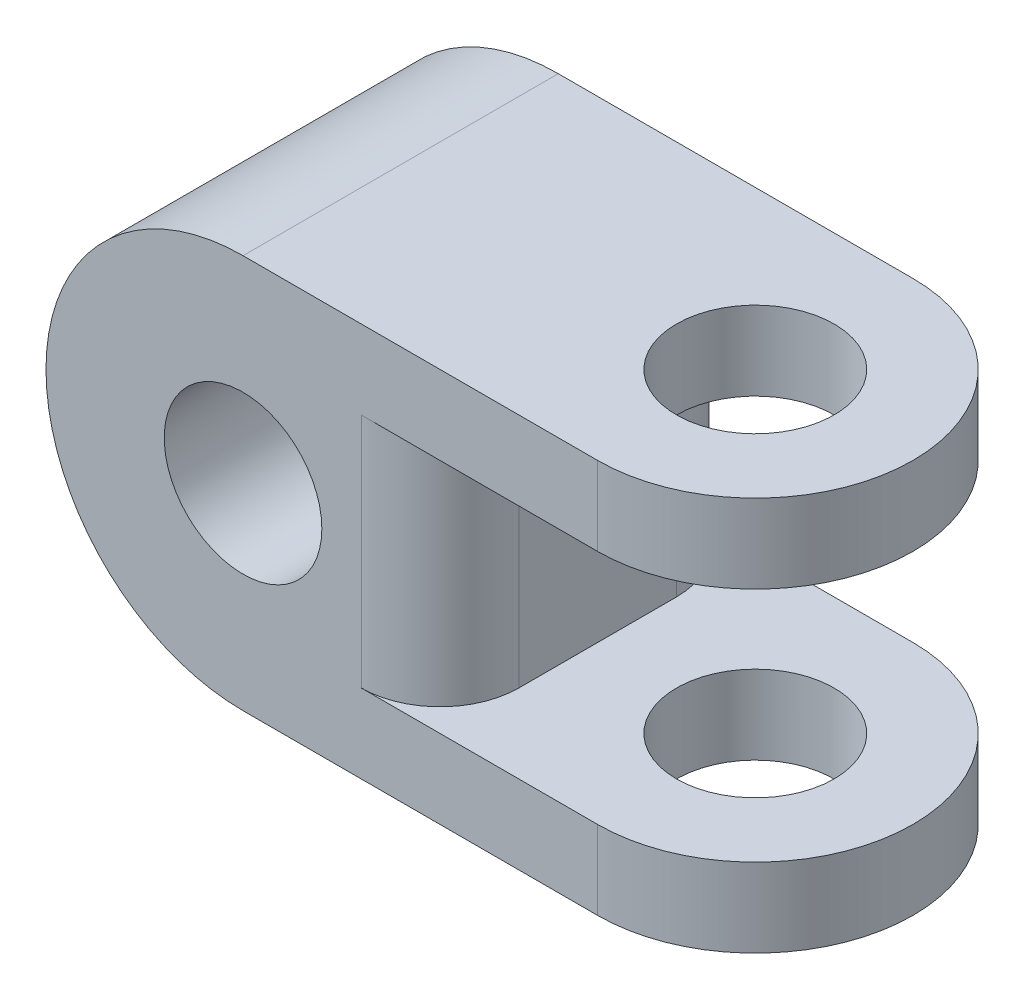
ISO-10303-21;
HEADER;
FILE_DESCRIPTION(('STEP AP214'),'2;1');
FILE_NAME('part.step','',(''),(''),'','','');
FILE_SCHEMA(('AUTOMOTIVE_DESIGN { 1 0 10303 214 1 1 1 1 }'));
ENDSEC;
DATA;
#1=APPLICATION_CONTEXT('core data for automotive mechanical design processes');
#2=APPLICATION_PROTOCOL_DEFINITION('international standard','automotive_design',2000,#1);
#3=PRODUCT_CONTEXT('',#1,'mechanical');
#4=PRODUCT('Part','Part','',(#3));
#5=PRODUCT_RELATED_PRODUCT_CATEGORY('part','',(#4));
#6=PRODUCT_DEFINITION_FORMATION('','',#4);
#7=PRODUCT_DEFINITION_CONTEXT('part definition',#1,'design');
#8=PRODUCT_DEFINITION('design','',#6,#7);
#9=PRODUCT_DEFINITION_SHAPE('','',#8);
#10=(LENGTH_UNIT() NAMED_UNIT(*) SI_UNIT(.MILLI.,.METRE.));
#11=(NAMED_UNIT(*) PLANE_ANGLE_UNIT() SI_UNIT($,.RADIAN.));
#12=(NAMED_UNIT(*) SI_UNIT($,.STERADIAN.) SOLID_ANGLE_UNIT());
#13=UNCERTAINTY_MEASURE_WITH_UNIT(LENGTH_MEASURE(1.E-05),#10,'distance_accuracy_value','');
#14=(GEOMETRIC_REPRESENTATION_CONTEXT(3) GLOBAL_UNCERTAINTY_ASSIGNED_CONTEXT((#13)) GLOBAL_UNIT_ASSIGNED_CONTEXT((#10,
#11,#12)) REPRESENTATION_CONTEXT('',''));
#15=CARTESIAN_POINT('',(0.,0.,0.));
#16=DIRECTION('',(0.,0.,1.));
#17=DIRECTION('',(1.,0.,0.));
#18=AXIS2_PLACEMENT_3D('',#15,#16,#17);
#19=CARTESIAN_POINT('',(-20.,0.,0.));
#20=DIRECTION('',(0.,1.,0.));
#21=DIRECTION('',(0.,0.,1.));
#22=AXIS2_PLACEMENT_3D('',#19,#20,#21);
#23=CYLINDRICAL_SURFACE('',#22,20.);
#24=DIRECTION('',(0.,-1.,0.));
#25=VECTOR('',#24,1.);
#26=CARTESIAN_POINT('',(-20.,0.,20.));
#27=LINE('',#26,#25);
#28=CARTESIAN_POINT('',(-20.,0.,20.));
#29=VERTEX_POINT('',#28);
#30=CARTESIAN_POINT('',(-20.,10.,20.));
#31=VERTEX_POINT('',#30);
#32=EDGE_CURVE('E121',#29,#31,#27,.F.);
#33=ORIENTED_EDGE('',*,*,#32,.F.);
#34=CARTESIAN_POINT('',(-20.,0.,0.));
#35=DIRECTION('',(0.,1.,0.));
#36=DIRECTION('',(-1.,0.,0.));
#37=AXIS2_PLACEMENT_3D('',#34,#35,#36);
#38=CIRCLE('',#37,20.);
#39=CARTESIAN_POINT('',(-20.,0.,-20.));
#40=VERTEX_POINT('',#39);
#41=EDGE_CURVE('E47',#40,#29,#38,.F.);
#42=ORIENTED_EDGE('',*,*,#41,.F.);
#43=DIRECTION('',(0.,1.,0.));
#44=VECTOR('',#43,1.);
#45=CARTESIAN_POINT('',(-20.,-15.,-20.));
#46=LINE('',#45,#44);
#47=CARTESIAN_POINT('',(-20.,10.,-20.));
#48=VERTEX_POINT('',#47);
#49=EDGE_CURVE('E194',#48,#40,#46,.F.);
#50=ORIENTED_EDGE('',*,*,#49,.F.);
#51=CARTESIAN_POINT('',(-20.,10.,0.));
#52=DIRECTION('',(0.,-1.,0.));
#53=DIRECTION('',(1.,0.,0.));
#54=AXIS2_PLACEMENT_3D('',#51,#52,#53);
#55=CIRCLE('',#54,20.);
#56=EDGE_CURVE('E11',#31,#48,#55,.F.);
#57=ORIENTED_EDGE('',*,*,#56,.F.);
#58=EDGE_LOOP('',(#33,#42,#50,#57));
#59=FACE_BOUND('',#58,.T.);
#60=ADVANCED_FACE('F39',(#59),#23,.T.);
#61=CARTESIAN_POINT('',(-20.,-40.,0.));
#62=DIRECTION('',(0.,1.,0.));
#63=DIRECTION('',(0.,0.,1.));
#64=AXIS2_PLACEMENT_3D('',#61,#62,#63);
#65=CYLINDRICAL_SURFACE('',#64,20.);
#66=DIRECTION('',(0.,-1.,0.));
#67=VECTOR('',#66,1.);
#68=CARTESIAN_POINT('',(-20.,-40.,20.));
#69=LINE('',#68,#67);
#70=CARTESIAN_POINT('',(-20.,-40.,20.));
#71=VERTEX_POINT('',#70);
#72=CARTESIAN_POINT('',(-20.,-30.,20.));
#73=VERTEX_POINT('',#72);
#74=EDGE_CURVE('E183',#71,#73,#69,.F.);
#75=ORIENTED_EDGE('',*,*,#74,.F.);
#76=CARTESIAN_POINT('',(-20.,-40.,0.));
#77=DIRECTION('',(0.,1.,0.));
#78=DIRECTION('',(0.,0.,1.));
#79=AXIS2_PLACEMENT_3D('',#76,#77,#78);
#80=CIRCLE('',#79,20.);
#81=CARTESIAN_POINT('',(-20.,-40.,-20.));
#82=VERTEX_POINT('',#81);
#83=EDGE_CURVE('E189',#82,#71,#80,.F.);
#84=ORIENTED_EDGE('',*,*,#83,.F.);
#85=DIRECTION('',(0.,1.,0.));
#86=VECTOR('',#85,1.);
#87=CARTESIAN_POINT('',(-20.,-15.,-20.));
#88=LINE('',#87,#86);
#89=CARTESIAN_POINT('',(-20.,-30.,-20.));
#90=VERTEX_POINT('',#89);
#91=EDGE_CURVE('E186',#90,#82,#88,.F.);
#92=ORIENTED_EDGE('',*,*,#91,.F.);
#93=CARTESIAN_POINT('',(-20.,-30.,0.));
#94=DIRECTION('',(0.,-1.,0.));
#95=DIRECTION('',(1.,0.,0.));
#96=AXIS2_PLACEMENT_3D('',#93,#94,#95);
#97=CIRCLE('',#96,20.);
#98=EDGE_CURVE('E191',#73,#90,#97,.F.);
#99=ORIENTED_EDGE('',*,*,#98,.F.);
#100=EDGE_LOOP('',(#75,#84,#92,#99));
#101=FACE_BOUND('',#100,.T.);
#102=ADVANCED_FACE('F233',(#101),#65,.T.);
#103=CARTESIAN_POINT('',(-65.,-15.,20.));
#104=DIRECTION('',(0.,0.,1.));
#105=DIRECTION('',(1.,0.,0.));
#106=AXIS2_PLACEMENT_3D('',#103,#104,#105);
#107=PLANE('',#106);
#108=DIRECTION('',(1.,0.,0.));
#109=VECTOR('',#108,1.);
#110=CARTESIAN_POINT('',(-40.,0.,20.));
#111=LINE('',#110,#109);
#112=CARTESIAN_POINT('',(-50.,0.,20.));
#113=VERTEX_POINT('',#112);
#114=EDGE_CURVE('E122',#113,#29,#111,.T.);
#115=ORIENTED_EDGE('',*,*,#114,.T.);
#116=ORIENTED_EDGE('',*,*,#32,.T.);
#117=DIRECTION('',(-1.,0.,0.));
#118=VECTOR('',#117,1.);
#119=CARTESIAN_POINT('',(0.,10.,20.));
#120=LINE('',#119,#118);
#121=CARTESIAN_POINT('',(-65.,9.99999999999999,20.));
#122=VERTEX_POINT('',#121);
#123=EDGE_CURVE('E112',#31,#122,#120,.T.);
#124=ORIENTED_EDGE('',*,*,#123,.T.);
#125=CARTESIAN_POINT('',(-65.,-15.,20.));
#126=DIRECTION('',(0.,0.,1.));
#127=DIRECTION('',(1.,0.,0.));
#128=AXIS2_PLACEMENT_3D('',#125,#126,#127);
#129=CIRCLE('',#128,25.);
#130=CARTESIAN_POINT('',(-65.,-40.,20.));
#131=VERTEX_POINT('',#130);
#132=EDGE_CURVE('E119',#122,#131,#129,.T.);
#133=ORIENTED_EDGE('',*,*,#132,.T.);
#134=DIRECTION('',(1.,0.,0.));
#135=VECTOR('',#134,1.);
#136=CARTESIAN_POINT('',(-65.,-40.,20.));
#137=LINE('',#136,#135);
#138=EDGE_CURVE('E137',#131,#71,#137,.T.);
#139=ORIENTED_EDGE('',*,*,#138,.T.);
#140=ORIENTED_EDGE('',*,*,#74,.T.);
#141=DIRECTION('',(-1.,0.,0.));
#142=VECTOR('',#141,1.);
#143=CARTESIAN_POINT('',(0.,-30.,20.));
#144=LINE('',#143,#142);
#145=CARTESIAN_POINT('',(-50.,-30.,20.));
#146=VERTEX_POINT('',#145);
#147=EDGE_CURVE('E139',#73,#146,#144,.T.);
#148=ORIENTED_EDGE('',*,*,#147,.T.);
#149=DIRECTION('',(0.,1.,0.));
#150=VECTOR('',#149,1.);
#151=CARTESIAN_POINT('',(-50.,0.,20.));
#152=LINE('',#151,#150);
#153=EDGE_CURVE('E170',#146,#113,#152,.T.);
#154=ORIENTED_EDGE('',*,*,#153,.T.);
#155=EDGE_LOOP('',(#115,#116,#124,#133,#139,#140,#148,#154));
#156=FACE_BOUND('',#155,.T.);
#157=CARTESIAN_POINT('',(-65.,-15.,20.));
#158=DIRECTION('',(0.,0.,1.));
#159=DIRECTION('',(1.,0.,0.));
#160=AXIS2_PLACEMENT_3D('',#157,#158,#159);
#161=CIRCLE('',#160,10.);
#162=CARTESIAN_POINT('',(-55.,-15.,20.));
#163=VERTEX_POINT('',#162);
#164=EDGE_CURVE('E148',#163,#163,#161,.T.);
#165=ORIENTED_EDGE('',*,*,#164,.F.);
#166=EDGE_LOOP('',(#165));
#167=FACE_BOUND('',#166,.T.);
#168=ADVANCED_FACE('F115',(#156,#167),#107,.T.);
#169=CARTESIAN_POINT('',(-65.,-15.,-20.));
#170=DIRECTION('',(0.,0.,1.));
#171=DIRECTION('',(1.,0.,0.));
#172=AXIS2_PLACEMENT_3D('',#169,#170,#171);
#173=PLANE('',#172);
#174=DIRECTION('',(-1.,0.,0.));
#175=VECTOR('',#174,1.);
#176=CARTESIAN_POINT('',(0.,10.,-20.));
#177=LINE('',#176,#175);
#178=CARTESIAN_POINT('',(-65.,9.99999999999999,-20.));
#179=VERTEX_POINT('',#178);
#180=EDGE_CURVE('E128',#48,#179,#177,.T.);
#181=ORIENTED_EDGE('',*,*,#180,.F.);
#182=ORIENTED_EDGE('',*,*,#49,.T.);
#183=DIRECTION('',(1.,0.,0.));
#184=VECTOR('',#183,1.);
#185=CARTESIAN_POINT('',(-40.,0.,-20.));
#186=LINE('',#185,#184);
#187=CARTESIAN_POINT('',(-50.,0.,-20.));
#188=VERTEX_POINT('',#187);
#189=EDGE_CURVE('E145',#188,#40,#186,.T.);
#190=ORIENTED_EDGE('',*,*,#189,.F.);
#191=DIRECTION('',(0.,1.,0.));
#192=VECTOR('',#191,1.);
#193=CARTESIAN_POINT('',(-50.,-15.,-20.));
#194=LINE('',#193,#192);
#195=CARTESIAN_POINT('',(-50.,-30.,-20.));
#196=VERTEX_POINT('',#195);
#197=EDGE_CURVE('E167',#188,#196,#194,.F.);
#198=ORIENTED_EDGE('',*,*,#197,.T.);
#199=DIRECTION('',(-1.,0.,0.));
#200=VECTOR('',#199,1.);
#201=CARTESIAN_POINT('',(0.,-30.,-20.));
#202=LINE('',#201,#200);
#203=EDGE_CURVE('E155',#90,#196,#202,.T.);
#204=ORIENTED_EDGE('',*,*,#203,.F.);
#205=ORIENTED_EDGE('',*,*,#91,.T.);
#206=DIRECTION('',(1.,0.,0.));
#207=VECTOR('',#206,1.);
#208=CARTESIAN_POINT('',(-65.,-40.,-20.));
#209=LINE('',#208,#207);
#210=CARTESIAN_POINT('',(-65.,-40.,-20.));
#211=VERTEX_POINT('',#210);
#212=EDGE_CURVE('E152',#211,#82,#209,.T.);
#213=ORIENTED_EDGE('',*,*,#212,.F.);
#214=CARTESIAN_POINT('',(-65.,-15.,-20.));
#215=DIRECTION('',(0.,0.,1.));
#216=DIRECTION('',(1.,0.,0.));
#217=AXIS2_PLACEMENT_3D('',#214,#215,#216);
#218=CIRCLE('',#217,25.);
#219=EDGE_CURVE('E150',#179,#211,#218,.T.);
#220=ORIENTED_EDGE('',*,*,#219,.F.);
#221=EDGE_LOOP('',(#181,#182,#190,#198,#204,#205,#213,#220));
#222=FACE_BOUND('',#221,.T.);
#223=CARTESIAN_POINT('',(-65.,-15.,-20.));
#224=DIRECTION('',(0.,0.,1.));
#225=DIRECTION('',(1.,0.,0.));
#226=AXIS2_PLACEMENT_3D('',#223,#224,#225);
#227=CIRCLE('',#226,10.);
#228=CARTESIAN_POINT('',(-55.,-15.,-20.));
#229=VERTEX_POINT('',#228);
#230=EDGE_CURVE('E200',#229,#229,#227,.T.);
#231=ORIENTED_EDGE('',*,*,#230,.T.);
#232=EDGE_LOOP('',(#231));
#233=FACE_BOUND('',#232,.T.);
#234=ADVANCED_FACE('F237',(#222,#233),#173,.F.);
#235=CARTESIAN_POINT('',(-40.,0.,20.));
#236=DIRECTION('',(-1.,0.,0.));
#237=DIRECTION('',(0.,-1.,0.));
#238=AXIS2_PLACEMENT_3D('',#235,#236,#237);
#239=PLANE('',#238);
#240=DIRECTION('',(0.,0.,-1.));
#241=VECTOR('',#240,1.);
#242=CARTESIAN_POINT('',(-40.,-30.,20.));
#243=LINE('',#242,#241);
#244=CARTESIAN_POINT('',(-40.,-30.,10.));
#245=VERTEX_POINT('',#244);
#246=CARTESIAN_POINT('',(-40.,-30.,-10.));
#247=VERTEX_POINT('',#246);
#248=EDGE_CURVE('E144',#245,#247,#243,.T.);
#249=ORIENTED_EDGE('',*,*,#248,.T.);
#250=DIRECTION('',(0.,1.,0.));
#251=VECTOR('',#250,1.);
#252=CARTESIAN_POINT('',(-40.,0.,-10.));
#253=LINE('',#252,#251);
#254=CARTESIAN_POINT('',(-40.,0.,-10.));
#255=VERTEX_POINT('',#254);
#256=EDGE_CURVE('E164',#247,#255,#253,.T.);
#257=ORIENTED_EDGE('',*,*,#256,.T.);
#258=DIRECTION('',(0.,0.,-1.));
#259=VECTOR('',#258,1.);
#260=CARTESIAN_POINT('',(-40.,0.,20.));
#261=LINE('',#260,#259);
#262=CARTESIAN_POINT('',(-40.,0.,10.));
#263=VERTEX_POINT('',#262);
#264=EDGE_CURVE('E131',#263,#255,#261,.T.);
#265=ORIENTED_EDGE('',*,*,#264,.F.);
#266=DIRECTION('',(0.,1.,0.));
#267=VECTOR('',#266,1.);
#268=CARTESIAN_POINT('',(-40.,-30.,10.));
#269=LINE('',#268,#267);
#270=EDGE_CURVE('E162',#263,#245,#269,.F.);
#271=ORIENTED_EDGE('',*,*,#270,.T.);
#272=EDGE_LOOP('',(#249,#257,#265,#271));
#273=FACE_BOUND('',#272,.T.);
#274=ADVANCED_FACE('F244',(#273),#239,.F.);
#275=CARTESIAN_POINT('',(-40.,0.,20.));
#276=DIRECTION('',(0.,1.,0.));
#277=DIRECTION('',(-1.,0.,0.));
#278=AXIS2_PLACEMENT_3D('',#275,#276,#277);
#279=PLANE('',#278);
#280=CARTESIAN_POINT('',(-20.,0.,0.));
#281=DIRECTION('',(0.,1.,0.));
#282=DIRECTION('',(-1.,0.,0.));
#283=AXIS2_PLACEMENT_3D('',#280,#281,#282);
#284=CIRCLE('',#283,10.);
#285=CARTESIAN_POINT('',(-30.,0.,0.));
#286=VERTEX_POINT('',#285);
#287=EDGE_CURVE('E203',#286,#286,#284,.F.);
#288=ORIENTED_EDGE('',*,*,#287,.F.);
#289=EDGE_LOOP('',(#288));
#290=FACE_BOUND('',#289,.T.);
#291=ORIENTED_EDGE('',*,*,#189,.T.);
#292=ORIENTED_EDGE('',*,*,#41,.T.);
#293=ORIENTED_EDGE('',*,*,#114,.F.);
#294=CARTESIAN_POINT('',(-50.,0.,10.));
#295=DIRECTION('',(0.,1.,0.));
#296=DIRECTION('',(-1.,0.,0.));
#297=AXIS2_PLACEMENT_3D('',#294,#295,#296);
#298=CIRCLE('',#297,10.);
#299=EDGE_CURVE('E178',#113,#263,#298,.T.);
#300=ORIENTED_EDGE('',*,*,#299,.T.);
#301=ORIENTED_EDGE('',*,*,#264,.T.);
#302=CARTESIAN_POINT('',(-50.,0.,-10.));
#303=DIRECTION('',(0.,1.,0.));
#304=DIRECTION('',(-1.,0.,0.));
#305=AXIS2_PLACEMENT_3D('',#302,#303,#304);
#306=CIRCLE('',#305,10.);
#307=EDGE_CURVE('E173',#255,#188,#306,.T.);
#308=ORIENTED_EDGE('',*,*,#307,.T.);
#309=EDGE_LOOP('',(#291,#292,#293,#300,#301,#308));
#310=FACE_BOUND('',#309,.T.);
#311=ADVANCED_FACE('F196',(#290,#310),#279,.F.);
#312=CARTESIAN_POINT('',(0.,10.,20.));
#313=DIRECTION('',(0.,-1.,0.));
#314=DIRECTION('',(1.,0.,0.));
#315=AXIS2_PLACEMENT_3D('',#312,#313,#314);
#316=PLANE('',#315);
#317=CARTESIAN_POINT('',(-20.,10.,0.));
#318=DIRECTION('',(0.,1.,0.));
#319=DIRECTION('',(-1.,0.,0.));
#320=AXIS2_PLACEMENT_3D('',#317,#318,#319);
#321=CIRCLE('',#320,10.);
#322=CARTESIAN_POINT('',(-30.,10.,0.));
#323=VERTEX_POINT('',#322);
#324=EDGE_CURVE('E206',#323,#323,#321,.T.);
#325=ORIENTED_EDGE('',*,*,#324,.F.);
#326=EDGE_LOOP('',(#325));
#327=FACE_BOUND('',#326,.T.);
#328=ORIENTED_EDGE('',*,*,#123,.F.);
#329=ORIENTED_EDGE('',*,*,#56,.T.);
#330=ORIENTED_EDGE('',*,*,#180,.T.);
#331=DIRECTION('',(0.,0.,-1.));
#332=VECTOR('',#331,1.);
#333=CARTESIAN_POINT('',(-65.,9.99999999999999,20.));
#334=LINE('',#333,#332);
#335=EDGE_CURVE('E125',#122,#179,#334,.T.);
#336=ORIENTED_EDGE('',*,*,#335,.F.);
#337=EDGE_LOOP('',(#328,#329,#330,#336));
#338=FACE_BOUND('',#337,.T.);
#339=ADVANCED_FACE('F126',(#327,#338),#316,.F.);
#340=CARTESIAN_POINT('',(-65.,-15.,20.));
#341=DIRECTION('',(0.,0.,-1.));
#342=DIRECTION('',(-1.,0.,0.));
#343=AXIS2_PLACEMENT_3D('',#340,#341,#342);
#344=CYLINDRICAL_SURFACE('',#343,25.);
#345=ORIENTED_EDGE('',*,*,#219,.T.);
#346=DIRECTION('',(0.,0.,-1.));
#347=VECTOR('',#346,1.);
#348=CARTESIAN_POINT('',(-65.,-40.,20.));
#349=LINE('',#348,#347);
#350=EDGE_CURVE('E132',#131,#211,#349,.T.);
#351=ORIENTED_EDGE('',*,*,#350,.F.);
#352=ORIENTED_EDGE('',*,*,#132,.F.);
#353=ORIENTED_EDGE('',*,*,#335,.T.);
#354=EDGE_LOOP('',(#345,#351,#352,#353));
#355=FACE_BOUND('',#354,.T.);
#356=ADVANCED_FACE('F134',(#355),#344,.T.);
#357=CARTESIAN_POINT('',(-65.,-40.,20.));
#358=DIRECTION('',(0.,1.,0.));
#359=DIRECTION('',(0.,0.,1.));
#360=AXIS2_PLACEMENT_3D('',#357,#358,#359);
#361=PLANE('',#360);
#362=CARTESIAN_POINT('',(-20.,-40.,0.));
#363=DIRECTION('',(0.,1.,0.));
#364=DIRECTION('',(0.,0.,1.));
#365=AXIS2_PLACEMENT_3D('',#362,#363,#364);
#366=CIRCLE('',#365,10.);
#367=CARTESIAN_POINT('',(-20.,-40.,10.));
#368=VERTEX_POINT('',#367);
#369=EDGE_CURVE('E209',#368,#368,#366,.F.);
#370=ORIENTED_EDGE('',*,*,#369,.F.);
#371=EDGE_LOOP('',(#370));
#372=FACE_BOUND('',#371,.T.);
#373=ORIENTED_EDGE('',*,*,#212,.T.);
#374=ORIENTED_EDGE('',*,*,#83,.T.);
#375=ORIENTED_EDGE('',*,*,#138,.F.);
#376=ORIENTED_EDGE('',*,*,#350,.T.);
#377=EDGE_LOOP('',(#373,#374,#375,#376));
#378=FACE_BOUND('',#377,.T.);
#379=ADVANCED_FACE('F225',(#372,#378),#361,.F.);
#380=CARTESIAN_POINT('',(0.,-30.,20.));
#381=DIRECTION('',(0.,-1.,0.));
#382=DIRECTION('',(1.,0.,0.));
#383=AXIS2_PLACEMENT_3D('',#380,#381,#382);
#384=PLANE('',#383);
#385=CARTESIAN_POINT('',(-20.,-30.,0.));
#386=DIRECTION('',(0.,-1.,0.));
#387=DIRECTION('',(1.,0.,0.));
#388=AXIS2_PLACEMENT_3D('',#385,#386,#387);
#389=CIRCLE('',#388,10.);
#390=CARTESIAN_POINT('',(-9.99999999999998,-30.,0.));
#391=VERTEX_POINT('',#390);
#392=EDGE_CURVE('E214',#391,#391,#389,.F.);
#393=ORIENTED_EDGE('',*,*,#392,.F.);
#394=EDGE_LOOP('',(#393));
#395=FACE_BOUND('',#394,.T.);
#396=ORIENTED_EDGE('',*,*,#147,.F.);
#397=ORIENTED_EDGE('',*,*,#98,.T.);
#398=ORIENTED_EDGE('',*,*,#203,.T.);
#399=CARTESIAN_POINT('',(-50.,-30.,-10.));
#400=DIRECTION('',(0.,-1.,0.));
#401=DIRECTION('',(1.,0.,0.));
#402=AXIS2_PLACEMENT_3D('',#399,#400,#401);
#403=CIRCLE('',#402,10.);
#404=EDGE_CURVE('E176',#196,#247,#403,.T.);
#405=ORIENTED_EDGE('',*,*,#404,.T.);
#406=ORIENTED_EDGE('',*,*,#248,.F.);
#407=CARTESIAN_POINT('',(-50.,-30.,10.));
#408=DIRECTION('',(0.,-1.,0.));
#409=DIRECTION('',(1.,0.,0.));
#410=AXIS2_PLACEMENT_3D('',#407,#408,#409);
#411=CIRCLE('',#410,10.);
#412=EDGE_CURVE('E180',#245,#146,#411,.T.);
#413=ORIENTED_EDGE('',*,*,#412,.T.);
#414=EDGE_LOOP('',(#396,#397,#398,#405,#406,#413));
#415=FACE_BOUND('',#414,.T.);
#416=ADVANCED_FACE('F221',(#395,#415),#384,.F.);
#417=CARTESIAN_POINT('',(-65.,-15.,20.));
#418=DIRECTION('',(0.,0.,-1.));
#419=DIRECTION('',(-1.,0.,0.));
#420=AXIS2_PLACEMENT_3D('',#417,#418,#419);
#421=CYLINDRICAL_SURFACE('',#420,10.);
#422=ORIENTED_EDGE('',*,*,#164,.T.);
#423=EDGE_LOOP('',(#422));
#424=FACE_BOUND('',#423,.T.);
#425=ORIENTED_EDGE('',*,*,#230,.F.);
#426=EDGE_LOOP('',(#425));
#427=FACE_BOUND('',#426,.T.);
#428=ADVANCED_FACE('F224',(#424,#427),#421,.F.);
#429=CARTESIAN_POINT('',(-50.,0.,-10.));
#430=DIRECTION('',(0.,1.,0.));
#431=DIRECTION('',(-1.,0.,0.));
#432=AXIS2_PLACEMENT_3D('',#429,#430,#431);
#433=CYLINDRICAL_SURFACE('',#432,10.);
#434=ORIENTED_EDGE('',*,*,#404,.F.);
#435=ORIENTED_EDGE('',*,*,#197,.F.);
#436=ORIENTED_EDGE('',*,*,#307,.F.);
#437=ORIENTED_EDGE('',*,*,#256,.F.);
#438=EDGE_LOOP('',(#434,#435,#436,#437));
#439=FACE_BOUND('',#438,.T.);
#440=ADVANCED_FACE('F247',(#439),#433,.T.);
#441=CARTESIAN_POINT('',(-50.,-15.,10.));
#442=DIRECTION('',(0.,-1.,0.));
#443=DIRECTION('',(1.,0.,0.));
#444=AXIS2_PLACEMENT_3D('',#441,#442,#443);
#445=CYLINDRICAL_SURFACE('',#444,10.);
#446=ORIENTED_EDGE('',*,*,#412,.F.);
#447=ORIENTED_EDGE('',*,*,#270,.F.);
#448=ORIENTED_EDGE('',*,*,#299,.F.);
#449=ORIENTED_EDGE('',*,*,#153,.F.);
#450=EDGE_LOOP('',(#446,#447,#448,#449));
#451=FACE_BOUND('',#450,.T.);
#452=ADVANCED_FACE('F249',(#451),#445,.T.);
#453=CARTESIAN_POINT('',(-20.,-40.001,0.));
#454=DIRECTION('',(0.,1.,0.));
#455=DIRECTION('',(-1.,0.,0.));
#456=AXIS2_PLACEMENT_3D('',#453,#454,#455);
#457=CYLINDRICAL_SURFACE('',#456,10.);
#458=ORIENTED_EDGE('',*,*,#324,.T.);
#459=EDGE_LOOP('',(#458));
#460=FACE_BOUND('',#459,.T.);
#461=ORIENTED_EDGE('',*,*,#287,.T.);
#462=EDGE_LOOP('',(#461));
#463=FACE_BOUND('',#462,.T.);
#464=ADVANCED_FACE('F251',(#460,#463),#457,.F.);
#465=CARTESIAN_POINT('',(-20.,-40.001,0.));
#466=DIRECTION('',(0.,1.,0.));
#467=DIRECTION('',(-1.,0.,0.));
#468=AXIS2_PLACEMENT_3D('',#465,#466,#467);
#469=CYLINDRICAL_SURFACE('',#468,10.);
#470=ORIENTED_EDGE('',*,*,#392,.T.);
#471=EDGE_LOOP('',(#470));
#472=FACE_BOUND('',#471,.T.);
#473=ORIENTED_EDGE('',*,*,#369,.T.);
#474=EDGE_LOOP('',(#473));
#475=FACE_BOUND('',#474,.T.);
#476=ADVANCED_FACE('F218',(#472,#475),#469,.F.);
#477=CLOSED_SHELL('',(#60,#102,#168,#234,#274,#311,#339,#356,#379,#416,#428,#440,#452,#464,#476));
#478=MANIFOLD_SOLID_BREP('B2',#477);
#479=ADVANCED_BREP_SHAPE_REPRESENTATION('',(#18,#478),#14);
#480=SHAPE_DEFINITION_REPRESENTATION(#9,#479);
ENDSEC;
END-ISO-10303-21;
